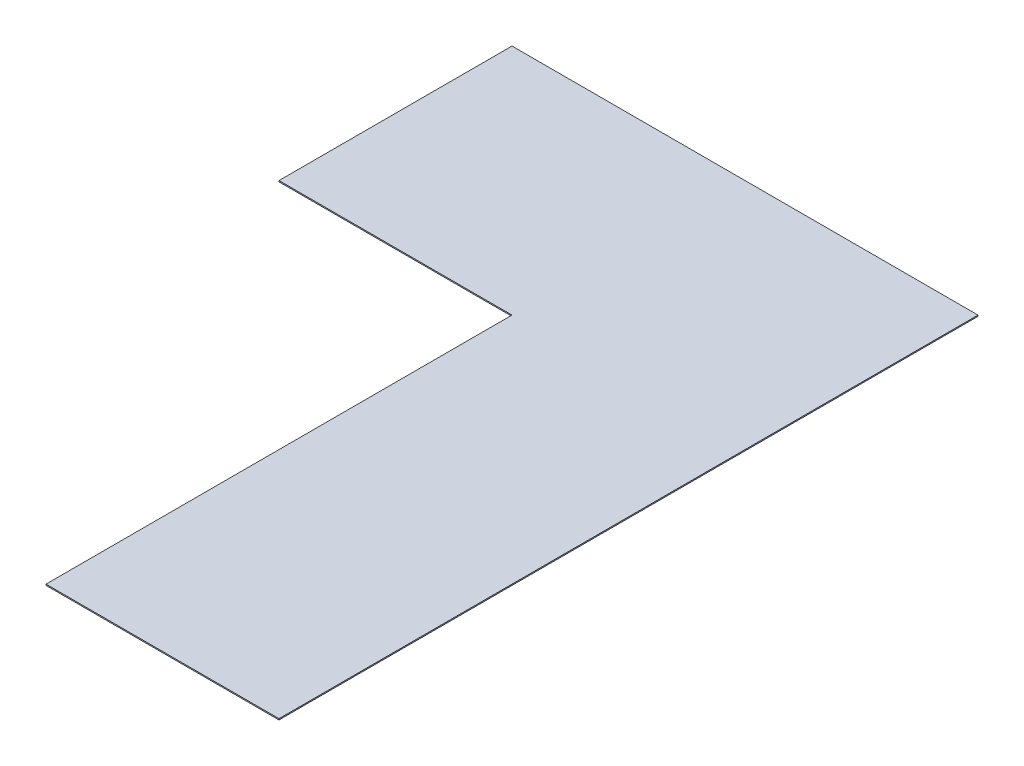
ISO-10303-21;
HEADER;
FILE_DESCRIPTION(('STEP AP214'),'2;1');
FILE_NAME('part.step','',(''),(''),'','','');
FILE_SCHEMA(('AUTOMOTIVE_DESIGN { 1 0 10303 214 1 1 1 1 }'));
ENDSEC;
DATA;
#1=APPLICATION_CONTEXT('core data for automotive mechanical design processes');
#2=APPLICATION_PROTOCOL_DEFINITION('international standard','automotive_design',2000,#1);
#3=PRODUCT_CONTEXT('',#1,'mechanical');
#4=PRODUCT('Part','Part','',(#3));
#5=PRODUCT_RELATED_PRODUCT_CATEGORY('part','',(#4));
#6=PRODUCT_DEFINITION_FORMATION('','',#4);
#7=PRODUCT_DEFINITION_CONTEXT('part definition',#1,'design');
#8=PRODUCT_DEFINITION('design','',#6,#7);
#9=PRODUCT_DEFINITION_SHAPE('','',#8);
#10=(LENGTH_UNIT() NAMED_UNIT(*) SI_UNIT(.MILLI.,.METRE.));
#11=(NAMED_UNIT(*) PLANE_ANGLE_UNIT() SI_UNIT($,.RADIAN.));
#12=(NAMED_UNIT(*) SI_UNIT($,.STERADIAN.) SOLID_ANGLE_UNIT());
#13=UNCERTAINTY_MEASURE_WITH_UNIT(LENGTH_MEASURE(1.E-05),#10,'distance_accuracy_value','');
#14=(GEOMETRIC_REPRESENTATION_CONTEXT(3) GLOBAL_UNCERTAINTY_ASSIGNED_CONTEXT((#13)) GLOBAL_UNIT_ASSIGNED_CONTEXT((#10,
#11,#12)) REPRESENTATION_CONTEXT('',''));
#15=CARTESIAN_POINT('',(0.,0.,0.));
#16=DIRECTION('',(0.,0.,1.));
#17=DIRECTION('',(1.,0.,0.));
#18=AXIS2_PLACEMENT_3D('',#15,#16,#17);
#19=CARTESIAN_POINT('',(0.,2.601,0.519070689291638));
#20=DIRECTION('',(0.,0.,-1.));
#21=DIRECTION('',(-1.,0.,0.));
#22=AXIS2_PLACEMENT_3D('',#19,#20,#21);
#23=PLANE('',#22);
#24=DIRECTION('',(1.,0.,0.));
#25=VECTOR('',#24,1.);
#26=CARTESIAN_POINT('',(0.,2.6,0.519070689291638));
#27=LINE('',#26,#25);
#28=CARTESIAN_POINT('',(4.17318429210772,2.6,0.519070689291638));
#29=VERTEX_POINT('',#28);
#30=CARTESIAN_POINT('',(4.37318429210738,2.6,0.519070689291638));
#31=VERTEX_POINT('',#30);
#32=EDGE_CURVE('E11',#29,#31,#27,.T.);
#33=ORIENTED_EDGE('',*,*,#32,.T.);
#34=DIRECTION('',(0.,-1.,0.));
#35=VECTOR('',#34,1.);
#36=CARTESIAN_POINT('',(4.37318429210738,2.601,0.519070689291638));
#37=LINE('',#36,#35);
#38=CARTESIAN_POINT('',(4.37318429210738,2.601,0.519070689291638));
#39=VERTEX_POINT('',#38);
#40=EDGE_CURVE('E24',#39,#31,#37,.T.);
#41=ORIENTED_EDGE('',*,*,#40,.F.);
#42=DIRECTION('',(1.,0.,0.));
#43=VECTOR('',#42,1.);
#44=CARTESIAN_POINT('',(0.,2.601,0.519070689291638));
#45=LINE('',#44,#43);
#46=CARTESIAN_POINT('',(4.17318429210772,2.601,0.519070689291638));
#47=VERTEX_POINT('',#46);
#48=EDGE_CURVE('E117',#47,#39,#45,.T.);
#49=ORIENTED_EDGE('',*,*,#48,.F.);
#50=DIRECTION('',(0.,-1.,0.));
#51=VECTOR('',#50,1.);
#52=CARTESIAN_POINT('',(4.17318429210772,2.601,0.519070689291638));
#53=LINE('',#52,#51);
#54=EDGE_CURVE('E90',#47,#29,#53,.T.);
#55=ORIENTED_EDGE('',*,*,#54,.T.);
#56=EDGE_LOOP('',(#33,#41,#49,#55));
#57=FACE_BOUND('',#56,.T.);
#58=ADVANCED_FACE('F17',(#57),#23,.F.);
#59=CARTESIAN_POINT('',(4.37318429210739,2.601,0.));
#60=DIRECTION('',(1.,0.,0.));
#61=DIRECTION('',(0.,0.,-1.));
#62=AXIS2_PLACEMENT_3D('',#59,#60,#61);
#63=PLANE('',#62);
#64=DIRECTION('',(0.,0.,1.));
#65=VECTOR('',#64,1.);
#66=CARTESIAN_POINT('',(4.37318429210739,2.6,0.));
#67=LINE('',#66,#65);
#68=CARTESIAN_POINT('',(4.37318429210739,2.6,0.919070689291635));
#69=VERTEX_POINT('',#68);
#70=EDGE_CURVE('E114',#31,#69,#67,.T.);
#71=ORIENTED_EDGE('',*,*,#70,.T.);
#72=DIRECTION('',(0.,-1.,0.));
#73=VECTOR('',#72,1.);
#74=CARTESIAN_POINT('',(4.37318429210739,2.601,0.919070689291635));
#75=LINE('',#74,#73);
#76=CARTESIAN_POINT('',(4.37318429210739,2.601,0.919070689291635));
#77=VERTEX_POINT('',#76);
#78=EDGE_CURVE('E111',#77,#69,#75,.T.);
#79=ORIENTED_EDGE('',*,*,#78,.F.);
#80=DIRECTION('',(0.,0.,1.));
#81=VECTOR('',#80,1.);
#82=CARTESIAN_POINT('',(4.37318429210739,2.601,0.));
#83=LINE('',#82,#81);
#84=EDGE_CURVE('E108',#39,#77,#83,.T.);
#85=ORIENTED_EDGE('',*,*,#84,.F.);
#86=ORIENTED_EDGE('',*,*,#40,.T.);
#87=EDGE_LOOP('',(#71,#79,#85,#86));
#88=FACE_BOUND('',#87,.T.);
#89=ADVANCED_FACE('F120',(#88),#63,.F.);
#90=CARTESIAN_POINT('',(0.,2.601,0.919070689291635));
#91=DIRECTION('',(0.,0.,-1.));
#92=DIRECTION('',(-1.,0.,0.));
#93=AXIS2_PLACEMENT_3D('',#90,#91,#92);
#94=PLANE('',#93);
#95=DIRECTION('',(1.,0.,0.));
#96=VECTOR('',#95,1.);
#97=CARTESIAN_POINT('',(0.,2.6,0.919070689291635));
#98=LINE('',#97,#96);
#99=CARTESIAN_POINT('',(4.57318429210704,2.6,0.919070689291635));
#100=VERTEX_POINT('',#99);
#101=EDGE_CURVE('E106',#69,#100,#98,.T.);
#102=ORIENTED_EDGE('',*,*,#101,.T.);
#103=DIRECTION('',(0.,-1.,0.));
#104=VECTOR('',#103,1.);
#105=CARTESIAN_POINT('',(4.57318429210704,2.601,0.919070689291635));
#106=LINE('',#105,#104);
#107=CARTESIAN_POINT('',(4.57318429210704,2.601,0.919070689291635));
#108=VERTEX_POINT('',#107);
#109=EDGE_CURVE('E103',#108,#100,#106,.T.);
#110=ORIENTED_EDGE('',*,*,#109,.F.);
#111=DIRECTION('',(1.,0.,0.));
#112=VECTOR('',#111,1.);
#113=CARTESIAN_POINT('',(0.,2.601,0.919070689291635));
#114=LINE('',#113,#112);
#115=EDGE_CURVE('E101',#77,#108,#114,.T.);
#116=ORIENTED_EDGE('',*,*,#115,.F.);
#117=ORIENTED_EDGE('',*,*,#78,.T.);
#118=EDGE_LOOP('',(#102,#110,#116,#117));
#119=FACE_BOUND('',#118,.T.);
#120=ADVANCED_FACE('F124',(#119),#94,.F.);
#121=CARTESIAN_POINT('',(4.57318429210707,2.601,2.57829329923314E-13));
#122=DIRECTION('',(1.,0.,0.));
#123=DIRECTION('',(0.,0.,-1.));
#124=AXIS2_PLACEMENT_3D('',#121,#122,#123);
#125=PLANE('',#124);
#126=DIRECTION('',(0.,0.,1.));
#127=VECTOR('',#126,1.);
#128=CARTESIAN_POINT('',(4.57318429210707,2.6,2.57829329923314E-13));
#129=LINE('',#128,#127);
#130=CARTESIAN_POINT('',(4.57318429210705,2.6,0.319070689291639));
#131=VERTEX_POINT('',#130);
#132=EDGE_CURVE('E98',#131,#100,#129,.T.);
#133=ORIENTED_EDGE('',*,*,#132,.F.);
#134=DIRECTION('',(0.,-1.,0.));
#135=VECTOR('',#134,1.);
#136=CARTESIAN_POINT('',(4.57318429210705,2.601,0.319070689291639));
#137=LINE('',#136,#135);
#138=CARTESIAN_POINT('',(4.57318429210705,2.601,0.319070689291639));
#139=VERTEX_POINT('',#138);
#140=EDGE_CURVE('E96',#139,#131,#137,.T.);
#141=ORIENTED_EDGE('',*,*,#140,.F.);
#142=DIRECTION('',(0.,0.,1.));
#143=VECTOR('',#142,1.);
#144=CARTESIAN_POINT('',(4.57318429210707,2.601,2.57829329923314E-13));
#145=LINE('',#144,#143);
#146=EDGE_CURVE('E85',#139,#108,#145,.T.);
#147=ORIENTED_EDGE('',*,*,#146,.T.);
#148=ORIENTED_EDGE('',*,*,#109,.T.);
#149=EDGE_LOOP('',(#133,#141,#147,#148));
#150=FACE_BOUND('',#149,.T.);
#151=ADVANCED_FACE('F127',(#150),#125,.T.);
#152=CARTESIAN_POINT('',(0.,2.601,0.319070689291639));
#153=DIRECTION('',(0.,0.,-1.));
#154=DIRECTION('',(-1.,0.,0.));
#155=AXIS2_PLACEMENT_3D('',#152,#153,#154);
#156=PLANE('',#155);
#157=DIRECTION('',(1.,0.,0.));
#158=VECTOR('',#157,1.);
#159=CARTESIAN_POINT('',(0.,2.6,0.319070689291639));
#160=LINE('',#159,#158);
#161=CARTESIAN_POINT('',(4.17318429210773,2.6,0.319070689291639));
#162=VERTEX_POINT('',#161);
#163=EDGE_CURVE('E72',#162,#131,#160,.T.);
#164=ORIENTED_EDGE('',*,*,#163,.F.);
#165=DIRECTION('',(0.,-1.,0.));
#166=VECTOR('',#165,1.);
#167=CARTESIAN_POINT('',(4.17318429210773,2.601,0.319070689291639));
#168=LINE('',#167,#166);
#169=CARTESIAN_POINT('',(4.17318429210773,2.601,0.319070689291639));
#170=VERTEX_POINT('',#169);
#171=EDGE_CURVE('E66',#170,#162,#168,.T.);
#172=ORIENTED_EDGE('',*,*,#171,.F.);
#173=DIRECTION('',(1.,0.,0.));
#174=VECTOR('',#173,1.);
#175=CARTESIAN_POINT('',(0.,2.601,0.319070689291639));
#176=LINE('',#175,#174);
#177=EDGE_CURVE('E70',#170,#139,#176,.T.);
#178=ORIENTED_EDGE('',*,*,#177,.T.);
#179=ORIENTED_EDGE('',*,*,#140,.T.);
#180=EDGE_LOOP('',(#164,#172,#178,#179));
#181=FACE_BOUND('',#180,.T.);
#182=ADVANCED_FACE('F68',(#181),#156,.T.);
#183=CARTESIAN_POINT('',(4.17318429210775,2.601,2.35277924735653E-13));
#184=DIRECTION('',(1.,0.,0.));
#185=DIRECTION('',(0.,0.,-1.));
#186=AXIS2_PLACEMENT_3D('',#183,#184,#185);
#187=PLANE('',#186);
#188=DIRECTION('',(0.,0.,1.));
#189=VECTOR('',#188,1.);
#190=CARTESIAN_POINT('',(4.17318429210775,2.6,2.35277924735653E-13));
#191=LINE('',#190,#189);
#192=EDGE_CURVE('E86',#162,#29,#191,.T.);
#193=ORIENTED_EDGE('',*,*,#192,.T.);
#194=ORIENTED_EDGE('',*,*,#54,.F.);
#195=DIRECTION('',(0.,0.,1.));
#196=VECTOR('',#195,1.);
#197=CARTESIAN_POINT('',(4.17318429210775,2.601,2.35277924735653E-13));
#198=LINE('',#197,#196);
#199=EDGE_CURVE('E82',#170,#47,#198,.T.);
#200=ORIENTED_EDGE('',*,*,#199,.F.);
#201=ORIENTED_EDGE('',*,*,#171,.T.);
#202=EDGE_LOOP('',(#193,#194,#200,#201));
#203=FACE_BOUND('',#202,.T.);
#204=ADVANCED_FACE('F89',(#203),#187,.F.);
#205=CARTESIAN_POINT('',(0.,2.601,0.));
#206=DIRECTION('',(0.,1.,0.));
#207=DIRECTION('',(0.,0.,1.));
#208=AXIS2_PLACEMENT_3D('',#205,#206,#207);
#209=PLANE('',#208);
#210=ORIENTED_EDGE('',*,*,#48,.T.);
#211=ORIENTED_EDGE('',*,*,#84,.T.);
#212=ORIENTED_EDGE('',*,*,#115,.T.);
#213=ORIENTED_EDGE('',*,*,#146,.F.);
#214=ORIENTED_EDGE('',*,*,#177,.F.);
#215=ORIENTED_EDGE('',*,*,#199,.T.);
#216=EDGE_LOOP('',(#210,#211,#212,#213,#214,#215));
#217=FACE_BOUND('',#216,.T.);
#218=ADVANCED_FACE('F81',(#217),#209,.T.);
#219=CARTESIAN_POINT('',(0.,2.6,0.));
#220=DIRECTION('',(0.,1.,0.));
#221=DIRECTION('',(0.,0.,1.));
#222=AXIS2_PLACEMENT_3D('',#219,#220,#221);
#223=PLANE('',#222);
#224=ORIENTED_EDGE('',*,*,#32,.F.);
#225=ORIENTED_EDGE('',*,*,#192,.F.);
#226=ORIENTED_EDGE('',*,*,#163,.T.);
#227=ORIENTED_EDGE('',*,*,#132,.T.);
#228=ORIENTED_EDGE('',*,*,#101,.F.);
#229=ORIENTED_EDGE('',*,*,#70,.F.);
#230=EDGE_LOOP('',(#224,#225,#226,#227,#228,#229));
#231=FACE_BOUND('',#230,.T.);
#232=ADVANCED_FACE('F122',(#231),#223,.F.);
#233=CLOSED_SHELL('',(#58,#89,#120,#151,#182,#204,#218,#232));
#234=MANIFOLD_SOLID_BREP('B1',#233);
#235=ADVANCED_BREP_SHAPE_REPRESENTATION('',(#18,#234),#14);
#236=SHAPE_DEFINITION_REPRESENTATION(#9,#235);
ENDSEC;
END-ISO-10303-21;
